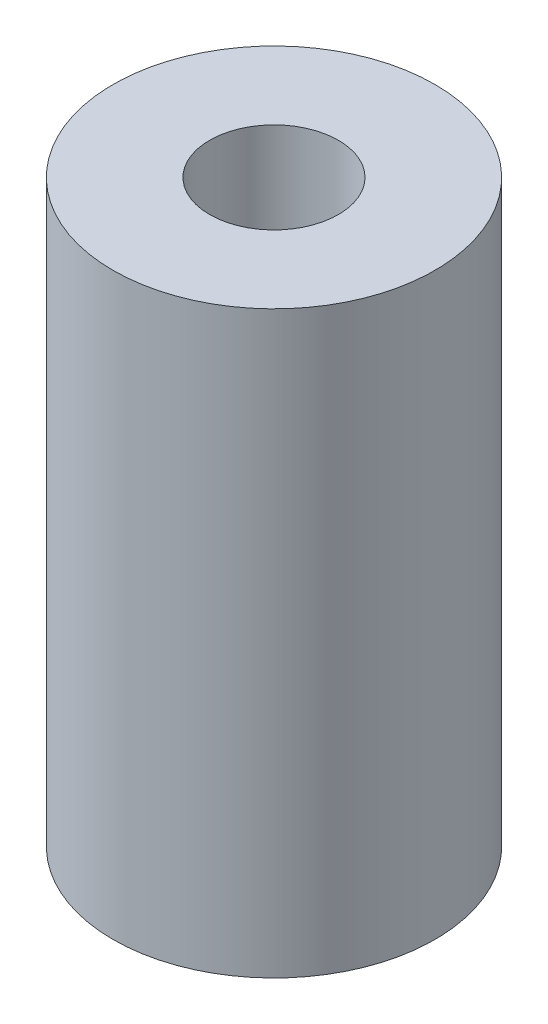
ISO-10303-21;
HEADER;
FILE_DESCRIPTION(('STEP AP214'),'2;1');
FILE_NAME('part.step','',(''),(''),'','','');
FILE_SCHEMA(('AUTOMOTIVE_DESIGN { 1 0 10303 214 1 1 1 1 }'));
ENDSEC;
DATA;
#1=APPLICATION_CONTEXT('core data for automotive mechanical design processes');
#2=APPLICATION_PROTOCOL_DEFINITION('international standard','automotive_design',2000,#1);
#3=PRODUCT_CONTEXT('',#1,'mechanical');
#4=PRODUCT('Part','Part','',(#3));
#5=PRODUCT_RELATED_PRODUCT_CATEGORY('part','',(#4));
#6=PRODUCT_DEFINITION_FORMATION('','',#4);
#7=PRODUCT_DEFINITION_CONTEXT('part definition',#1,'design');
#8=PRODUCT_DEFINITION('design','',#6,#7);
#9=PRODUCT_DEFINITION_SHAPE('','',#8);
#10=(LENGTH_UNIT() NAMED_UNIT(*) SI_UNIT(.MILLI.,.METRE.));
#11=(NAMED_UNIT(*) PLANE_ANGLE_UNIT() SI_UNIT($,.RADIAN.));
#12=(NAMED_UNIT(*) SI_UNIT($,.STERADIAN.) SOLID_ANGLE_UNIT());
#13=UNCERTAINTY_MEASURE_WITH_UNIT(LENGTH_MEASURE(1.E-05),#10,'distance_accuracy_value','');
#14=(GEOMETRIC_REPRESENTATION_CONTEXT(3) GLOBAL_UNCERTAINTY_ASSIGNED_CONTEXT((#13)) GLOBAL_UNIT_ASSIGNED_CONTEXT((#10,
#11,#12)) REPRESENTATION_CONTEXT('',''));
#15=CARTESIAN_POINT('',(0.,0.,0.));
#16=DIRECTION('',(0.,0.,1.));
#17=DIRECTION('',(1.,0.,0.));
#18=AXIS2_PLACEMENT_3D('',#15,#16,#17);
#19=CARTESIAN_POINT('',(0.,9.,0.));
#20=DIRECTION('',(0.,-1.,0.));
#21=DIRECTION('',(0.,0.,-1.));
#22=AXIS2_PLACEMENT_3D('',#19,#20,#21);
#23=CYLINDRICAL_SURFACE('',#22,2.5);
#24=CARTESIAN_POINT('',(0.,9.,0.));
#25=DIRECTION('',(0.,1.,0.));
#26=DIRECTION('',(0.,0.,1.));
#27=AXIS2_PLACEMENT_3D('',#24,#25,#26);
#28=CIRCLE('',#27,2.5);
#29=CARTESIAN_POINT('',(0.,9.,2.5));
#30=VERTEX_POINT('',#29);
#31=EDGE_CURVE('E10',#30,#30,#28,.T.);
#32=ORIENTED_EDGE('',*,*,#31,.F.);
#33=EDGE_LOOP('',(#32));
#34=FACE_BOUND('',#33,.T.);
#35=CARTESIAN_POINT('',(0.,0.,0.));
#36=DIRECTION('',(0.,1.,0.));
#37=DIRECTION('',(0.,0.,1.));
#38=AXIS2_PLACEMENT_3D('',#35,#36,#37);
#39=CIRCLE('',#38,2.5);
#40=CARTESIAN_POINT('',(0.,0.,2.5));
#41=VERTEX_POINT('',#40);
#42=EDGE_CURVE('E34',#41,#41,#39,.T.);
#43=ORIENTED_EDGE('',*,*,#42,.T.);
#44=EDGE_LOOP('',(#43));
#45=FACE_BOUND('',#44,.T.);
#46=ADVANCED_FACE('F31',(#34,#45),#23,.T.);
#47=CARTESIAN_POINT('',(0.,9.,0.));
#48=DIRECTION('',(0.,1.,0.));
#49=DIRECTION('',(0.,0.,1.));
#50=AXIS2_PLACEMENT_3D('',#47,#48,#49);
#51=PLANE('',#50);
#52=CARTESIAN_POINT('',(0.,9.,0.));
#53=DIRECTION('',(0.,1.,0.));
#54=DIRECTION('',(0.,0.,1.));
#55=AXIS2_PLACEMENT_3D('',#52,#53,#54);
#56=CIRCLE('',#55,1.);
#57=CARTESIAN_POINT('',(0.,9.,1.));
#58=VERTEX_POINT('',#57);
#59=EDGE_CURVE('E43',#58,#58,#56,.T.);
#60=ORIENTED_EDGE('',*,*,#59,.F.);
#61=EDGE_LOOP('',(#60));
#62=FACE_BOUND('',#61,.T.);
#63=ORIENTED_EDGE('',*,*,#31,.T.);
#64=EDGE_LOOP('',(#63));
#65=FACE_BOUND('',#64,.T.);
#66=ADVANCED_FACE('F58',(#62,#65),#51,.T.);
#67=CARTESIAN_POINT('',(0.,0.,0.));
#68=DIRECTION('',(0.,1.,0.));
#69=DIRECTION('',(0.,0.,1.));
#70=AXIS2_PLACEMENT_3D('',#67,#68,#69);
#71=PLANE('',#70);
#72=CARTESIAN_POINT('',(0.,0.,0.));
#73=DIRECTION('',(0.,1.,0.));
#74=DIRECTION('',(0.,0.,1.));
#75=AXIS2_PLACEMENT_3D('',#72,#73,#74);
#76=CIRCLE('',#75,1.);
#77=CARTESIAN_POINT('',(0.,0.,1.));
#78=VERTEX_POINT('',#77);
#79=EDGE_CURVE('E41',#78,#78,#76,.T.);
#80=ORIENTED_EDGE('',*,*,#79,.T.);
#81=EDGE_LOOP('',(#80));
#82=FACE_BOUND('',#81,.T.);
#83=ORIENTED_EDGE('',*,*,#42,.F.);
#84=EDGE_LOOP('',(#83));
#85=FACE_BOUND('',#84,.T.);
#86=ADVANCED_FACE('F49',(#82,#85),#71,.F.);
#87=CARTESIAN_POINT('',(0.,0.,0.));
#88=DIRECTION('',(0.,1.,0.));
#89=DIRECTION('',(0.,0.,1.));
#90=AXIS2_PLACEMENT_3D('',#87,#88,#89);
#91=CYLINDRICAL_SURFACE('',#90,1.);
#92=ORIENTED_EDGE('',*,*,#79,.F.);
#93=EDGE_LOOP('',(#92));
#94=FACE_BOUND('',#93,.T.);
#95=ORIENTED_EDGE('',*,*,#59,.T.);
#96=EDGE_LOOP('',(#95));
#97=FACE_BOUND('',#96,.T.);
#98=ADVANCED_FACE('F52',(#94,#97),#91,.F.);
#99=CLOSED_SHELL('',(#46,#66,#86,#98));
#100=MANIFOLD_SOLID_BREP('B2',#99);
#101=ADVANCED_BREP_SHAPE_REPRESENTATION('',(#18,#100),#14);
#102=SHAPE_DEFINITION_REPRESENTATION(#9,#101);
ENDSEC;
END-ISO-10303-21;
